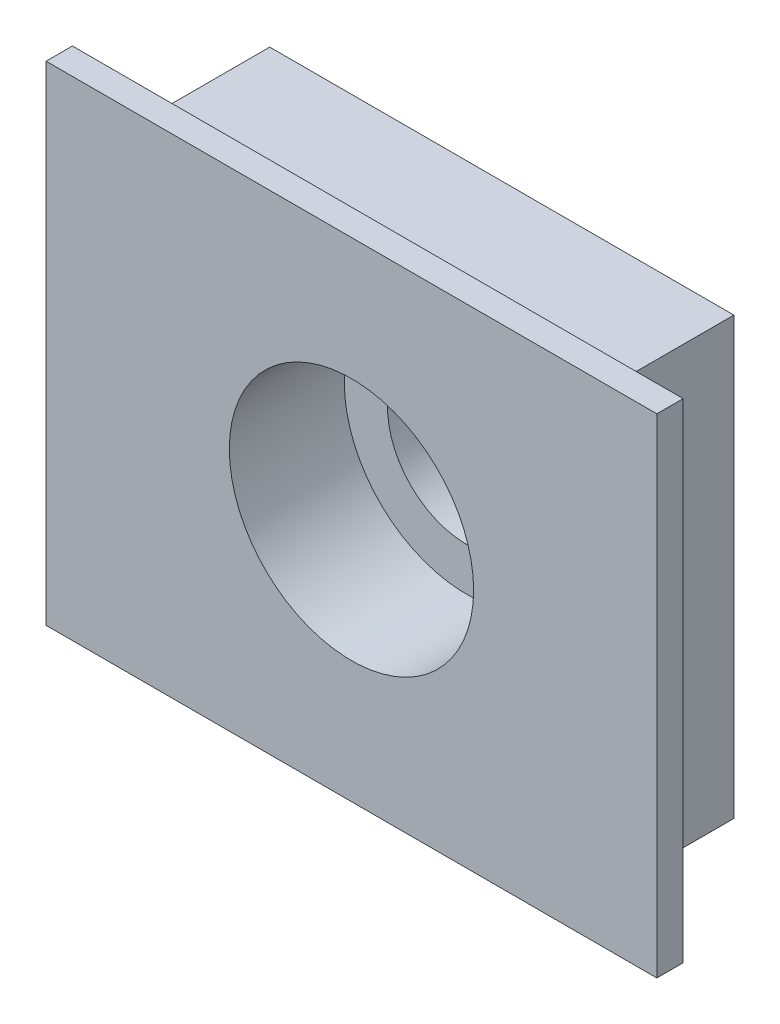
ISO-10303-21;
HEADER;
FILE_DESCRIPTION(('STEP AP214'),'2;1');
FILE_NAME('part.step','',(''),(''),'','','');
FILE_SCHEMA(('AUTOMOTIVE_DESIGN { 1 0 10303 214 1 1 1 1 }'));
ENDSEC;
DATA;
#1=APPLICATION_CONTEXT('core data for automotive mechanical design processes');
#2=APPLICATION_PROTOCOL_DEFINITION('international standard','automotive_design',2000,#1);
#3=PRODUCT_CONTEXT('',#1,'mechanical');
#4=PRODUCT('Part','Part','',(#3));
#5=PRODUCT_RELATED_PRODUCT_CATEGORY('part','',(#4));
#6=PRODUCT_DEFINITION_FORMATION('','',#4);
#7=PRODUCT_DEFINITION_CONTEXT('part definition',#1,'design');
#8=PRODUCT_DEFINITION('design','',#6,#7);
#9=PRODUCT_DEFINITION_SHAPE('','',#8);
#10=(LENGTH_UNIT() NAMED_UNIT(*) SI_UNIT(.MILLI.,.METRE.));
#11=(NAMED_UNIT(*) PLANE_ANGLE_UNIT() SI_UNIT($,.RADIAN.));
#12=(NAMED_UNIT(*) SI_UNIT($,.STERADIAN.) SOLID_ANGLE_UNIT());
#13=UNCERTAINTY_MEASURE_WITH_UNIT(LENGTH_MEASURE(1.E-05),#10,'distance_accuracy_value','');
#14=(GEOMETRIC_REPRESENTATION_CONTEXT(3) GLOBAL_UNCERTAINTY_ASSIGNED_CONTEXT((#13)) GLOBAL_UNIT_ASSIGNED_CONTEXT((#10,
#11,#12)) REPRESENTATION_CONTEXT('',''));
#15=CARTESIAN_POINT('',(0.,0.,0.));
#16=DIRECTION('',(0.,0.,1.));
#17=DIRECTION('',(1.,0.,0.));
#18=AXIS2_PLACEMENT_3D('',#15,#16,#17);
#19=CARTESIAN_POINT('',(0.,0.,-80.));
#20=DIRECTION('',(-1.,0.,0.));
#21=DIRECTION('',(0.,0.,1.));
#22=AXIS2_PLACEMENT_3D('',#19,#20,#21);
#23=PLANE('',#22);
#24=DIRECTION('',(0.,0.,1.));
#25=VECTOR('',#24,1.);
#26=CARTESIAN_POINT('',(0.,260.,-80.));
#27=LINE('',#26,#25);
#28=CARTESIAN_POINT('',(0.,260.,-14.));
#29=VERTEX_POINT('',#28);
#30=CARTESIAN_POINT('',(0.,260.,0.));
#31=VERTEX_POINT('',#30);
#32=EDGE_CURVE('E11',#29,#31,#27,.T.);
#33=ORIENTED_EDGE('',*,*,#32,.F.);
#34=DIRECTION('',(0.,1.,0.));
#35=VECTOR('',#34,1.);
#36=CARTESIAN_POINT('',(0.,260.,-14.));
#37=LINE('',#36,#35);
#38=CARTESIAN_POINT('',(0.,0.,-14.));
#39=VERTEX_POINT('',#38);
#40=EDGE_CURVE('E141',#39,#29,#37,.T.);
#41=ORIENTED_EDGE('',*,*,#40,.F.);
#42=DIRECTION('',(0.,0.,1.));
#43=VECTOR('',#42,1.);
#44=CARTESIAN_POINT('',(0.,0.,-80.));
#45=LINE('',#44,#43);
#46=CARTESIAN_POINT('',(0.,0.,0.));
#47=VERTEX_POINT('',#46);
#48=EDGE_CURVE('E165',#39,#47,#45,.T.);
#49=ORIENTED_EDGE('',*,*,#48,.T.);
#50=DIRECTION('',(0.,-1.,0.));
#51=VECTOR('',#50,1.);
#52=CARTESIAN_POINT('',(0.,0.,0.));
#53=LINE('',#52,#51);
#54=EDGE_CURVE('E151',#31,#47,#53,.T.);
#55=ORIENTED_EDGE('',*,*,#54,.F.);
#56=EDGE_LOOP('',(#33,#41,#49,#55));
#57=FACE_BOUND('',#56,.T.);
#58=ADVANCED_FACE('F33',(#57),#23,.T.);
#59=CARTESIAN_POINT('',(0.,260.,-80.));
#60=DIRECTION('',(0.,1.,0.));
#61=DIRECTION('',(0.,0.,1.));
#62=AXIS2_PLACEMENT_3D('',#59,#60,#61);
#63=PLANE('',#62);
#64=DIRECTION('',(0.,0.,1.));
#65=VECTOR('',#64,1.);
#66=CARTESIAN_POINT('',(325.,260.,-80.));
#67=LINE('',#66,#65);
#68=CARTESIAN_POINT('',(325.,260.,-14.));
#69=VERTEX_POINT('',#68);
#70=CARTESIAN_POINT('',(325.,260.,0.));
#71=VERTEX_POINT('',#70);
#72=EDGE_CURVE('E41',#69,#71,#67,.T.);
#73=ORIENTED_EDGE('',*,*,#72,.F.);
#74=DIRECTION('',(1.,0.,0.));
#75=VECTOR('',#74,1.);
#76=CARTESIAN_POINT('',(325.,260.,-14.));
#77=LINE('',#76,#75);
#78=EDGE_CURVE('E143',#29,#69,#77,.T.);
#79=ORIENTED_EDGE('',*,*,#78,.F.);
#80=ORIENTED_EDGE('',*,*,#32,.T.);
#81=DIRECTION('',(-1.,0.,0.));
#82=VECTOR('',#81,1.);
#83=CARTESIAN_POINT('',(0.,260.,0.));
#84=LINE('',#83,#82);
#85=EDGE_CURVE('E163',#71,#31,#84,.T.);
#86=ORIENTED_EDGE('',*,*,#85,.F.);
#87=EDGE_LOOP('',(#73,#79,#80,#86));
#88=FACE_BOUND('',#87,.T.);
#89=ADVANCED_FACE('F184',(#88),#63,.T.);
#90=CARTESIAN_POINT('',(325.,0.,-80.));
#91=DIRECTION('',(1.,0.,0.));
#92=DIRECTION('',(0.,0.,-1.));
#93=AXIS2_PLACEMENT_3D('',#90,#91,#92);
#94=PLANE('',#93);
#95=DIRECTION('',(0.,0.,1.));
#96=VECTOR('',#95,1.);
#97=CARTESIAN_POINT('',(325.,0.,-80.));
#98=LINE('',#97,#96);
#99=CARTESIAN_POINT('',(325.,0.,-14.));
#100=VERTEX_POINT('',#99);
#101=CARTESIAN_POINT('',(325.,0.,0.));
#102=VERTEX_POINT('',#101);
#103=EDGE_CURVE('E168',#100,#102,#98,.T.);
#104=ORIENTED_EDGE('',*,*,#103,.F.);
#105=DIRECTION('',(0.,-1.,0.));
#106=VECTOR('',#105,1.);
#107=CARTESIAN_POINT('',(325.,260.,-14.));
#108=LINE('',#107,#106);
#109=EDGE_CURVE('E49',#69,#100,#108,.T.);
#110=ORIENTED_EDGE('',*,*,#109,.F.);
#111=ORIENTED_EDGE('',*,*,#72,.T.);
#112=DIRECTION('',(0.,1.,0.));
#113=VECTOR('',#112,1.);
#114=CARTESIAN_POINT('',(325.,0.,0.));
#115=LINE('',#114,#113);
#116=EDGE_CURVE('E160',#102,#71,#115,.T.);
#117=ORIENTED_EDGE('',*,*,#116,.F.);
#118=EDGE_LOOP('',(#104,#110,#111,#117));
#119=FACE_BOUND('',#118,.T.);
#120=ADVANCED_FACE('F187',(#119),#94,.T.);
#121=CARTESIAN_POINT('',(0.,0.,-80.));
#122=DIRECTION('',(0.,-1.,0.));
#123=DIRECTION('',(0.,0.,-1.));
#124=AXIS2_PLACEMENT_3D('',#121,#122,#123);
#125=PLANE('',#124);
#126=ORIENTED_EDGE('',*,*,#48,.F.);
#127=DIRECTION('',(-1.,0.,0.));
#128=VECTOR('',#127,1.);
#129=CARTESIAN_POINT('',(325.,0.,-14.));
#130=LINE('',#129,#128);
#131=EDGE_CURVE('E139',#100,#39,#130,.T.);
#132=ORIENTED_EDGE('',*,*,#131,.F.);
#133=ORIENTED_EDGE('',*,*,#103,.T.);
#134=DIRECTION('',(1.,0.,0.));
#135=VECTOR('',#134,1.);
#136=CARTESIAN_POINT('',(0.,0.,0.));
#137=LINE('',#136,#135);
#138=EDGE_CURVE('E157',#47,#102,#137,.T.);
#139=ORIENTED_EDGE('',*,*,#138,.F.);
#140=EDGE_LOOP('',(#126,#132,#133,#139));
#141=FACE_BOUND('',#140,.T.);
#142=ADVANCED_FACE('F176',(#141),#125,.T.);
#143=CARTESIAN_POINT('',(0.,0.,-80.));
#144=DIRECTION('',(0.,0.,-1.));
#145=DIRECTION('',(-1.,0.,0.));
#146=AXIS2_PLACEMENT_3D('',#143,#144,#145);
#147=PLANE('',#146);
#148=CARTESIAN_POINT('',(162.5,130.,-80.));
#149=DIRECTION('',(0.,0.,1.));
#150=DIRECTION('',(1.,0.,0.));
#151=AXIS2_PLACEMENT_3D('',#148,#149,#150);
#152=CIRCLE('',#151,42.);
#153=CARTESIAN_POINT('',(204.5,130.,-80.));
#154=VERTEX_POINT('',#153);
#155=EDGE_CURVE('E145',#154,#154,#152,.T.);
#156=ORIENTED_EDGE('',*,*,#155,.T.);
#157=EDGE_LOOP('',(#156));
#158=FACE_BOUND('',#157,.T.);
#159=DIRECTION('',(1.,0.,0.));
#160=VECTOR('',#159,1.);
#161=CARTESIAN_POINT('',(286.,246.,-80.));
#162=LINE('',#161,#160);
#163=CARTESIAN_POINT('',(39.,246.,-80.));
#164=VERTEX_POINT('',#163);
#165=CARTESIAN_POINT('',(286.,246.,-80.));
#166=VERTEX_POINT('',#165);
#167=EDGE_CURVE('E123',#164,#166,#162,.T.);
#168=ORIENTED_EDGE('',*,*,#167,.T.);
#169=DIRECTION('',(0.,-1.,0.));
#170=VECTOR('',#169,1.);
#171=CARTESIAN_POINT('',(286.,246.,-80.));
#172=LINE('',#171,#170);
#173=CARTESIAN_POINT('',(286.,14.,-80.));
#174=VERTEX_POINT('',#173);
#175=EDGE_CURVE('E130',#166,#174,#172,.T.);
#176=ORIENTED_EDGE('',*,*,#175,.T.);
#177=DIRECTION('',(-1.,0.,0.));
#178=VECTOR('',#177,1.);
#179=CARTESIAN_POINT('',(286.,14.,-80.));
#180=LINE('',#179,#178);
#181=CARTESIAN_POINT('',(39.,14.,-80.));
#182=VERTEX_POINT('',#181);
#183=EDGE_CURVE('E104',#174,#182,#180,.T.);
#184=ORIENTED_EDGE('',*,*,#183,.T.);
#185=DIRECTION('',(0.,1.,0.));
#186=VECTOR('',#185,1.);
#187=CARTESIAN_POINT('',(39.,246.,-80.));
#188=LINE('',#187,#186);
#189=EDGE_CURVE('E57',#182,#164,#188,.T.);
#190=ORIENTED_EDGE('',*,*,#189,.T.);
#191=EDGE_LOOP('',(#168,#176,#184,#190));
#192=FACE_BOUND('',#191,.T.);
#193=ADVANCED_FACE('F194',(#158,#192),#147,.T.);
#194=CARTESIAN_POINT('',(0.,0.,0.));
#195=DIRECTION('',(0.,0.,-1.));
#196=DIRECTION('',(-1.,0.,0.));
#197=AXIS2_PLACEMENT_3D('',#194,#195,#196);
#198=PLANE('',#197);
#199=CARTESIAN_POINT('',(162.5,130.,0.));
#200=DIRECTION('',(0.,0.,1.));
#201=DIRECTION('',(1.,0.,0.));
#202=AXIS2_PLACEMENT_3D('',#199,#200,#201);
#203=CIRCLE('',#202,65.);
#204=CARTESIAN_POINT('',(227.5,130.,0.));
#205=VERTEX_POINT('',#204);
#206=EDGE_CURVE('E152',#205,#205,#203,.T.);
#207=ORIENTED_EDGE('',*,*,#206,.F.);
#208=EDGE_LOOP('',(#207));
#209=FACE_BOUND('',#208,.T.);
#210=ORIENTED_EDGE('',*,*,#54,.T.);
#211=ORIENTED_EDGE('',*,*,#138,.T.);
#212=ORIENTED_EDGE('',*,*,#116,.T.);
#213=ORIENTED_EDGE('',*,*,#85,.T.);
#214=EDGE_LOOP('',(#210,#211,#212,#213));
#215=FACE_BOUND('',#214,.T.);
#216=ADVANCED_FACE('F180',(#209,#215),#198,.F.);
#217=CARTESIAN_POINT('',(162.5,130.,-61.2));
#218=DIRECTION('',(0.,0.,1.));
#219=DIRECTION('',(1.,0.,0.));
#220=AXIS2_PLACEMENT_3D('',#217,#218,#219);
#221=CYLINDRICAL_SURFACE('',#220,65.);
#222=CARTESIAN_POINT('',(162.5,130.,-61.2));
#223=DIRECTION('',(0.,0.,1.));
#224=DIRECTION('',(1.,0.,0.));
#225=AXIS2_PLACEMENT_3D('',#222,#223,#224);
#226=CIRCLE('',#225,65.);
#227=CARTESIAN_POINT('',(227.5,130.,-61.2));
#228=VERTEX_POINT('',#227);
#229=EDGE_CURVE('E148',#228,#228,#226,.T.);
#230=ORIENTED_EDGE('',*,*,#229,.F.);
#231=EDGE_LOOP('',(#230));
#232=FACE_BOUND('',#231,.T.);
#233=ORIENTED_EDGE('',*,*,#206,.T.);
#234=EDGE_LOOP('',(#233));
#235=FACE_BOUND('',#234,.T.);
#236=ADVANCED_FACE('F280',(#232,#235),#221,.F.);
#237=CARTESIAN_POINT('',(162.5,130.,-61.2));
#238=DIRECTION('',(0.,0.,1.));
#239=DIRECTION('',(1.,0.,0.));
#240=AXIS2_PLACEMENT_3D('',#237,#238,#239);
#241=PLANE('',#240);
#242=CARTESIAN_POINT('',(162.5,130.,-61.2));
#243=DIRECTION('',(0.,0.,1.));
#244=DIRECTION('',(1.,0.,0.));
#245=AXIS2_PLACEMENT_3D('',#242,#243,#244);
#246=CIRCLE('',#245,42.);
#247=CARTESIAN_POINT('',(204.5,130.,-61.2));
#248=VERTEX_POINT('',#247);
#249=EDGE_CURVE('E36',#248,#248,#246,.T.);
#250=ORIENTED_EDGE('',*,*,#249,.F.);
#251=EDGE_LOOP('',(#250));
#252=FACE_BOUND('',#251,.T.);
#253=ORIENTED_EDGE('',*,*,#229,.T.);
#254=EDGE_LOOP('',(#253));
#255=FACE_BOUND('',#254,.T.);
#256=ADVANCED_FACE('F276',(#252,#255),#241,.T.);
#257=CARTESIAN_POINT('',(162.5,130.,-80.));
#258=DIRECTION('',(0.,0.,1.));
#259=DIRECTION('',(1.,0.,0.));
#260=AXIS2_PLACEMENT_3D('',#257,#258,#259);
#261=CYLINDRICAL_SURFACE('',#260,42.);
#262=ORIENTED_EDGE('',*,*,#249,.T.);
#263=EDGE_LOOP('',(#262));
#264=FACE_BOUND('',#263,.T.);
#265=ORIENTED_EDGE('',*,*,#155,.F.);
#266=EDGE_LOOP('',(#265));
#267=FACE_BOUND('',#266,.T.);
#268=ADVANCED_FACE('F234',(#264,#267),#261,.F.);
#269=CARTESIAN_POINT('',(0.,0.,-14.));
#270=DIRECTION('',(0.,0.,-1.));
#271=DIRECTION('',(-1.,0.,0.));
#272=AXIS2_PLACEMENT_3D('',#269,#270,#271);
#273=PLANE('',#272);
#274=DIRECTION('',(1.,0.,0.));
#275=VECTOR('',#274,1.);
#276=CARTESIAN_POINT('',(286.,246.,-14.));
#277=LINE('',#276,#275);
#278=CARTESIAN_POINT('',(39.,246.,-14.));
#279=VERTEX_POINT('',#278);
#280=CARTESIAN_POINT('',(286.,246.,-14.));
#281=VERTEX_POINT('',#280);
#282=EDGE_CURVE('E110',#279,#281,#277,.T.);
#283=ORIENTED_EDGE('',*,*,#282,.F.);
#284=DIRECTION('',(0.,1.,0.));
#285=VECTOR('',#284,1.);
#286=CARTESIAN_POINT('',(39.,246.,-14.));
#287=LINE('',#286,#285);
#288=CARTESIAN_POINT('',(39.,14.,-14.));
#289=VERTEX_POINT('',#288);
#290=EDGE_CURVE('E119',#289,#279,#287,.T.);
#291=ORIENTED_EDGE('',*,*,#290,.F.);
#292=DIRECTION('',(-1.,0.,0.));
#293=VECTOR('',#292,1.);
#294=CARTESIAN_POINT('',(286.,14.,-14.));
#295=LINE('',#294,#293);
#296=CARTESIAN_POINT('',(286.,14.,-14.));
#297=VERTEX_POINT('',#296);
#298=EDGE_CURVE('E102',#297,#289,#295,.T.);
#299=ORIENTED_EDGE('',*,*,#298,.F.);
#300=DIRECTION('',(0.,-1.,0.));
#301=VECTOR('',#300,1.);
#302=CARTESIAN_POINT('',(286.,246.,-14.));
#303=LINE('',#302,#301);
#304=EDGE_CURVE('E116',#281,#297,#303,.T.);
#305=ORIENTED_EDGE('',*,*,#304,.F.);
#306=EDGE_LOOP('',(#283,#291,#299,#305));
#307=FACE_BOUND('',#306,.T.);
#308=ORIENTED_EDGE('',*,*,#109,.T.);
#309=ORIENTED_EDGE('',*,*,#131,.T.);
#310=ORIENTED_EDGE('',*,*,#40,.T.);
#311=ORIENTED_EDGE('',*,*,#78,.T.);
#312=EDGE_LOOP('',(#308,#309,#310,#311));
#313=FACE_BOUND('',#312,.T.);
#314=ADVANCED_FACE('F115',(#307,#313),#273,.T.);
#315=CARTESIAN_POINT('',(286.,246.,-14.));
#316=DIRECTION('',(1.,0.,0.));
#317=DIRECTION('',(0.,0.,-1.));
#318=AXIS2_PLACEMENT_3D('',#315,#316,#317);
#319=PLANE('',#318);
#320=ORIENTED_EDGE('',*,*,#175,.F.);
#321=DIRECTION('',(0.,0.,-1.));
#322=VECTOR('',#321,1.);
#323=CARTESIAN_POINT('',(286.,246.,-14.));
#324=LINE('',#323,#322);
#325=EDGE_CURVE('E122',#281,#166,#324,.T.);
#326=ORIENTED_EDGE('',*,*,#325,.F.);
#327=ORIENTED_EDGE('',*,*,#304,.T.);
#328=DIRECTION('',(0.,0.,-1.));
#329=VECTOR('',#328,1.);
#330=CARTESIAN_POINT('',(286.,14.,-14.));
#331=LINE('',#330,#329);
#332=EDGE_CURVE('E99',#297,#174,#331,.T.);
#333=ORIENTED_EDGE('',*,*,#332,.T.);
#334=EDGE_LOOP('',(#320,#326,#327,#333));
#335=FACE_BOUND('',#334,.T.);
#336=ADVANCED_FACE('F121',(#335),#319,.T.);
#337=CARTESIAN_POINT('',(286.,246.,-14.));
#338=DIRECTION('',(0.,1.,0.));
#339=DIRECTION('',(0.,0.,1.));
#340=AXIS2_PLACEMENT_3D('',#337,#338,#339);
#341=PLANE('',#340);
#342=ORIENTED_EDGE('',*,*,#167,.F.);
#343=DIRECTION('',(0.,0.,-1.));
#344=VECTOR('',#343,1.);
#345=CARTESIAN_POINT('',(39.,246.,-14.));
#346=LINE('',#345,#344);
#347=EDGE_CURVE('E135',#279,#164,#346,.T.);
#348=ORIENTED_EDGE('',*,*,#347,.F.);
#349=ORIENTED_EDGE('',*,*,#282,.T.);
#350=ORIENTED_EDGE('',*,*,#325,.T.);
#351=EDGE_LOOP('',(#342,#348,#349,#350));
#352=FACE_BOUND('',#351,.T.);
#353=ADVANCED_FACE('F244',(#352),#341,.T.);
#354=CARTESIAN_POINT('',(39.,246.,-14.));
#355=DIRECTION('',(-1.,0.,0.));
#356=DIRECTION('',(0.,0.,1.));
#357=AXIS2_PLACEMENT_3D('',#354,#355,#356);
#358=PLANE('',#357);
#359=ORIENTED_EDGE('',*,*,#189,.F.);
#360=DIRECTION('',(0.,0.,-1.));
#361=VECTOR('',#360,1.);
#362=CARTESIAN_POINT('',(39.,14.,-14.));
#363=LINE('',#362,#361);
#364=EDGE_CURVE('E109',#289,#182,#363,.T.);
#365=ORIENTED_EDGE('',*,*,#364,.F.);
#366=ORIENTED_EDGE('',*,*,#290,.T.);
#367=ORIENTED_EDGE('',*,*,#347,.T.);
#368=EDGE_LOOP('',(#359,#365,#366,#367));
#369=FACE_BOUND('',#368,.T.);
#370=ADVANCED_FACE('F253',(#369),#358,.T.);
#371=CARTESIAN_POINT('',(286.,14.,-14.));
#372=DIRECTION('',(0.,-1.,0.));
#373=DIRECTION('',(0.,0.,-1.));
#374=AXIS2_PLACEMENT_3D('',#371,#372,#373);
#375=PLANE('',#374);
#376=ORIENTED_EDGE('',*,*,#183,.F.);
#377=ORIENTED_EDGE('',*,*,#332,.F.);
#378=ORIENTED_EDGE('',*,*,#298,.T.);
#379=ORIENTED_EDGE('',*,*,#364,.T.);
#380=EDGE_LOOP('',(#376,#377,#378,#379));
#381=FACE_BOUND('',#380,.T.);
#382=ADVANCED_FACE('F101',(#381),#375,.T.);
#383=CLOSED_SHELL('',(#58,#89,#120,#142,#193,#216,#236,#256,#268,#314,#336,#353,#370,#382));
#384=MANIFOLD_SOLID_BREP('B2',#383);
#385=ADVANCED_BREP_SHAPE_REPRESENTATION('',(#18,#384),#14);
#386=SHAPE_DEFINITION_REPRESENTATION(#9,#385);
ENDSEC;
END-ISO-10303-21;
